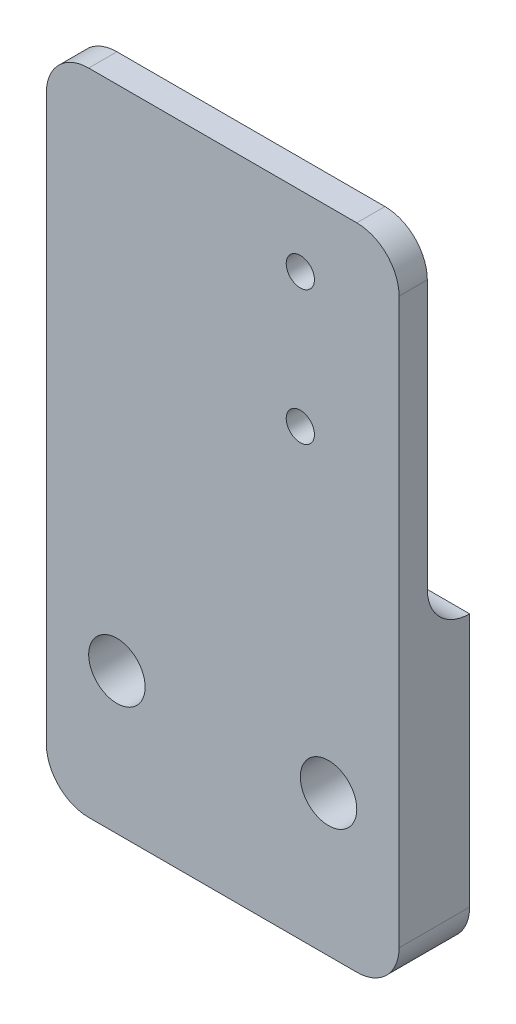
ISO-10303-21;
HEADER;
FILE_DESCRIPTION(('STEP AP214'),'2;1');
FILE_NAME('part.step','',(''),(''),'','','');
FILE_SCHEMA(('AUTOMOTIVE_DESIGN { 1 0 10303 214 1 1 1 1 }'));
ENDSEC;
DATA;
#1=APPLICATION_CONTEXT('core data for automotive mechanical design processes');
#2=APPLICATION_PROTOCOL_DEFINITION('international standard','automotive_design',2000,#1);
#3=PRODUCT_CONTEXT('',#1,'mechanical');
#4=PRODUCT('Part','Part','',(#3));
#5=PRODUCT_RELATED_PRODUCT_CATEGORY('part','',(#4));
#6=PRODUCT_DEFINITION_FORMATION('','',#4);
#7=PRODUCT_DEFINITION_CONTEXT('part definition',#1,'design');
#8=PRODUCT_DEFINITION('design','',#6,#7);
#9=PRODUCT_DEFINITION_SHAPE('','',#8);
#10=(LENGTH_UNIT() NAMED_UNIT(*) SI_UNIT(.MILLI.,.METRE.));
#11=(NAMED_UNIT(*) PLANE_ANGLE_UNIT() SI_UNIT($,.RADIAN.));
#12=(NAMED_UNIT(*) SI_UNIT($,.STERADIAN.) SOLID_ANGLE_UNIT());
#13=UNCERTAINTY_MEASURE_WITH_UNIT(LENGTH_MEASURE(1.E-05),#10,'distance_accuracy_value','');
#14=(GEOMETRIC_REPRESENTATION_CONTEXT(3) GLOBAL_UNCERTAINTY_ASSIGNED_CONTEXT((#13)) GLOBAL_UNIT_ASSIGNED_CONTEXT((#10,
#11,#12)) REPRESENTATION_CONTEXT('',''));
#15=CARTESIAN_POINT('',(0.,0.,0.));
#16=DIRECTION('',(0.,0.,1.));
#17=DIRECTION('',(1.,0.,0.));
#18=AXIS2_PLACEMENT_3D('',#15,#16,#17);
#19=CARTESIAN_POINT('',(0.,0.,5.));
#20=DIRECTION('',(0.,0.,-1.));
#21=DIRECTION('',(-1.,0.,0.));
#22=AXIS2_PLACEMENT_3D('',#19,#20,#21);
#23=PLANE('',#22);
#24=DIRECTION('',(-1.,0.,0.));
#25=VECTOR('',#24,1.);
#26=CARTESIAN_POINT('',(0.,46.,5.));
#27=LINE('',#26,#25);
#28=CARTESIAN_POINT('',(22.,46.,5.));
#29=VERTEX_POINT('',#28);
#30=CARTESIAN_POINT('',(3.,46.,5.));
#31=VERTEX_POINT('',#30);
#32=EDGE_CURVE('E193',#29,#31,#27,.T.);
#33=ORIENTED_EDGE('',*,*,#32,.T.);
#34=CARTESIAN_POINT('',(3.,43.,5.));
#35=DIRECTION('',(0.,0.,-1.));
#36=DIRECTION('',(-1.,0.,0.));
#37=AXIS2_PLACEMENT_3D('',#34,#35,#36);
#38=CIRCLE('',#37,3.);
#39=CARTESIAN_POINT('',(0.,43.,5.));
#40=VERTEX_POINT('',#39);
#41=EDGE_CURVE('E233',#31,#40,#38,.F.);
#42=ORIENTED_EDGE('',*,*,#41,.T.);
#43=DIRECTION('',(0.,-1.,0.));
#44=VECTOR('',#43,1.);
#45=CARTESIAN_POINT('',(0.,0.,5.));
#46=LINE('',#45,#44);
#47=CARTESIAN_POINT('',(0.,3.,5.));
#48=VERTEX_POINT('',#47);
#49=EDGE_CURVE('E180',#40,#48,#46,.T.);
#50=ORIENTED_EDGE('',*,*,#49,.T.);
#51=CARTESIAN_POINT('',(3.,3.,5.));
#52=DIRECTION('',(0.,0.,-1.));
#53=DIRECTION('',(-1.,0.,0.));
#54=AXIS2_PLACEMENT_3D('',#51,#52,#53);
#55=CIRCLE('',#54,3.);
#56=CARTESIAN_POINT('',(3.,0.,5.));
#57=VERTEX_POINT('',#56);
#58=EDGE_CURVE('E227',#48,#57,#55,.F.);
#59=ORIENTED_EDGE('',*,*,#58,.T.);
#60=DIRECTION('',(1.,0.,0.));
#61=VECTOR('',#60,1.);
#62=CARTESIAN_POINT('',(0.,0.,5.));
#63=LINE('',#62,#61);
#64=CARTESIAN_POINT('',(22.,0.,5.));
#65=VERTEX_POINT('',#64);
#66=EDGE_CURVE('E184',#57,#65,#63,.T.);
#67=ORIENTED_EDGE('',*,*,#66,.T.);
#68=CARTESIAN_POINT('',(22.,3.,5.));
#69=DIRECTION('',(0.,0.,-1.));
#70=DIRECTION('',(-1.,0.,0.));
#71=AXIS2_PLACEMENT_3D('',#68,#69,#70);
#72=CIRCLE('',#71,3.);
#73=CARTESIAN_POINT('',(25.,3.,5.));
#74=VERTEX_POINT('',#73);
#75=EDGE_CURVE('E224',#65,#74,#72,.F.);
#76=ORIENTED_EDGE('',*,*,#75,.T.);
#77=DIRECTION('',(0.,1.,0.));
#78=VECTOR('',#77,1.);
#79=CARTESIAN_POINT('',(25.,0.,5.));
#80=LINE('',#79,#78);
#81=CARTESIAN_POINT('',(25.,43.,5.));
#82=VERTEX_POINT('',#81);
#83=EDGE_CURVE('E189',#74,#82,#80,.T.);
#84=ORIENTED_EDGE('',*,*,#83,.T.);
#85=CARTESIAN_POINT('',(22.,43.,5.));
#86=DIRECTION('',(0.,0.,-1.));
#87=DIRECTION('',(-1.,0.,0.));
#88=AXIS2_PLACEMENT_3D('',#85,#86,#87);
#89=CIRCLE('',#88,3.);
#90=EDGE_CURVE('E230',#82,#29,#89,.F.);
#91=ORIENTED_EDGE('',*,*,#90,.T.);
#92=EDGE_LOOP('',(#33,#42,#50,#59,#67,#76,#84,#91));
#93=FACE_BOUND('',#92,.T.);
#94=CARTESIAN_POINT('',(20.,10.,5.));
#95=DIRECTION('',(0.,0.,1.));
#96=DIRECTION('',(1.,0.,0.));
#97=AXIS2_PLACEMENT_3D('',#94,#95,#96);
#98=CIRCLE('',#97,1.99999999999999);
#99=CARTESIAN_POINT('',(22.,10.,5.));
#100=VERTEX_POINT('',#99);
#101=EDGE_CURVE('E175',#100,#100,#98,.T.);
#102=ORIENTED_EDGE('',*,*,#101,.F.);
#103=EDGE_LOOP('',(#102));
#104=FACE_BOUND('',#103,.T.);
#105=CARTESIAN_POINT('',(5.,10.,5.));
#106=DIRECTION('',(0.,0.,1.));
#107=DIRECTION('',(1.,0.,0.));
#108=AXIS2_PLACEMENT_3D('',#105,#106,#107);
#109=CIRCLE('',#108,1.99999999999999);
#110=CARTESIAN_POINT('',(6.99999999999999,10.,5.));
#111=VERTEX_POINT('',#110);
#112=EDGE_CURVE('E262',#111,#111,#109,.T.);
#113=ORIENTED_EDGE('',*,*,#112,.F.);
#114=EDGE_LOOP('',(#113));
#115=FACE_BOUND('',#114,.T.);
#116=CARTESIAN_POINT('',(18.,31.5,5.));
#117=DIRECTION('',(0.,0.,1.));
#118=DIRECTION('',(1.,0.,0.));
#119=AXIS2_PLACEMENT_3D('',#116,#117,#118);
#120=CIRCLE('',#119,1.);
#121=CARTESIAN_POINT('',(19.,31.5,5.));
#122=VERTEX_POINT('',#121);
#123=EDGE_CURVE('E270',#122,#122,#120,.T.);
#124=ORIENTED_EDGE('',*,*,#123,.F.);
#125=EDGE_LOOP('',(#124));
#126=FACE_BOUND('',#125,.T.);
#127=CARTESIAN_POINT('',(18.,41.,5.));
#128=DIRECTION('',(0.,0.,1.));
#129=DIRECTION('',(1.,0.,0.));
#130=AXIS2_PLACEMENT_3D('',#127,#128,#129);
#131=CIRCLE('',#130,1.);
#132=CARTESIAN_POINT('',(19.,41.,5.));
#133=VERTEX_POINT('',#132);
#134=EDGE_CURVE('E278',#133,#133,#131,.T.);
#135=ORIENTED_EDGE('',*,*,#134,.F.);
#136=EDGE_LOOP('',(#135));
#137=FACE_BOUND('',#136,.T.);
#138=ADVANCED_FACE('F64',(#93,#104,#115,#126,#137),#23,.F.);
#139=CARTESIAN_POINT('',(0.,0.,5.));
#140=DIRECTION('',(1.,0.,0.));
#141=DIRECTION('',(0.,0.,-1.));
#142=AXIS2_PLACEMENT_3D('',#139,#140,#141);
#143=PLANE('',#142);
#144=ORIENTED_EDGE('',*,*,#49,.F.);
#145=DIRECTION('',(0.,0.,-1.));
#146=VECTOR('',#145,1.);
#147=CARTESIAN_POINT('',(0.,43.,5.));
#148=LINE('',#147,#146);
#149=CARTESIAN_POINT('',(0.,43.,3.));
#150=VERTEX_POINT('',#149);
#151=EDGE_CURVE('E208',#40,#150,#148,.T.);
#152=ORIENTED_EDGE('',*,*,#151,.T.);
#153=DIRECTION('',(0.,1.,0.));
#154=VECTOR('',#153,1.);
#155=CARTESIAN_POINT('',(0.,46.,3.));
#156=LINE('',#155,#154);
#157=CARTESIAN_POINT('',(0.,24.,3.));
#158=VERTEX_POINT('',#157);
#159=EDGE_CURVE('E148',#158,#150,#156,.T.);
#160=ORIENTED_EDGE('',*,*,#159,.F.);
#161=CARTESIAN_POINT('',(0.,24.,0.));
#162=DIRECTION('',(1.,0.,0.));
#163=DIRECTION('',(0.,0.,-1.));
#164=AXIS2_PLACEMENT_3D('',#161,#162,#163);
#165=CIRCLE('',#164,3.);
#166=CARTESIAN_POINT('',(0.,21.,0.));
#167=VERTEX_POINT('',#166);
#168=EDGE_CURVE('E141',#158,#167,#165,.T.);
#169=ORIENTED_EDGE('',*,*,#168,.T.);
#170=DIRECTION('',(0.,-1.,0.));
#171=VECTOR('',#170,1.);
#172=CARTESIAN_POINT('',(0.,0.,0.));
#173=LINE('',#172,#171);
#174=CARTESIAN_POINT('',(0.,3.,0.));
#175=VERTEX_POINT('',#174);
#176=EDGE_CURVE('E145',#167,#175,#173,.T.);
#177=ORIENTED_EDGE('',*,*,#176,.T.);
#178=DIRECTION('',(0.,0.,-1.));
#179=VECTOR('',#178,1.);
#180=CARTESIAN_POINT('',(0.,3.,5.));
#181=LINE('',#180,#179);
#182=EDGE_CURVE('E205',#175,#48,#181,.F.);
#183=ORIENTED_EDGE('',*,*,#182,.T.);
#184=EDGE_LOOP('',(#144,#152,#160,#169,#177,#183));
#185=FACE_BOUND('',#184,.T.);
#186=ADVANCED_FACE('F144',(#185),#143,.F.);
#187=CARTESIAN_POINT('',(0.,0.,5.));
#188=DIRECTION('',(0.,1.,0.));
#189=DIRECTION('',(0.,0.,1.));
#190=AXIS2_PLACEMENT_3D('',#187,#188,#189);
#191=PLANE('',#190);
#192=ORIENTED_EDGE('',*,*,#66,.F.);
#193=DIRECTION('',(0.,0.,-1.));
#194=VECTOR('',#193,1.);
#195=CARTESIAN_POINT('',(3.,0.,5.));
#196=LINE('',#195,#194);
#197=CARTESIAN_POINT('',(3.,0.,0.));
#198=VERTEX_POINT('',#197);
#199=EDGE_CURVE('E246',#57,#198,#196,.T.);
#200=ORIENTED_EDGE('',*,*,#199,.T.);
#201=DIRECTION('',(1.,0.,0.));
#202=VECTOR('',#201,1.);
#203=CARTESIAN_POINT('',(0.,0.,0.));
#204=LINE('',#203,#202);
#205=CARTESIAN_POINT('',(22.,0.,0.));
#206=VERTEX_POINT('',#205);
#207=EDGE_CURVE('E162',#198,#206,#204,.T.);
#208=ORIENTED_EDGE('',*,*,#207,.T.);
#209=DIRECTION('',(0.,0.,-1.));
#210=VECTOR('',#209,1.);
#211=CARTESIAN_POINT('',(22.,0.,5.));
#212=LINE('',#211,#210);
#213=EDGE_CURVE('E243',#206,#65,#212,.F.);
#214=ORIENTED_EDGE('',*,*,#213,.T.);
#215=EDGE_LOOP('',(#192,#200,#208,#214));
#216=FACE_BOUND('',#215,.T.);
#217=ADVANCED_FACE('F292',(#216),#191,.F.);
#218=CARTESIAN_POINT('',(25.,0.,5.));
#219=DIRECTION('',(-1.,0.,0.));
#220=DIRECTION('',(0.,0.,1.));
#221=AXIS2_PLACEMENT_3D('',#218,#219,#220);
#222=PLANE('',#221);
#223=DIRECTION('',(0.,-1.,0.));
#224=VECTOR('',#223,1.);
#225=CARTESIAN_POINT('',(25.,46.,3.));
#226=LINE('',#225,#224);
#227=CARTESIAN_POINT('',(25.,43.,3.));
#228=VERTEX_POINT('',#227);
#229=CARTESIAN_POINT('',(25.,24.,3.));
#230=VERTEX_POINT('',#229);
#231=EDGE_CURVE('E163',#228,#230,#226,.T.);
#232=ORIENTED_EDGE('',*,*,#231,.F.);
#233=DIRECTION('',(0.,0.,-1.));
#234=VECTOR('',#233,1.);
#235=CARTESIAN_POINT('',(25.,43.,5.));
#236=LINE('',#235,#234);
#237=EDGE_CURVE('E240',#228,#82,#236,.F.);
#238=ORIENTED_EDGE('',*,*,#237,.T.);
#239=ORIENTED_EDGE('',*,*,#83,.F.);
#240=DIRECTION('',(0.,0.,-1.));
#241=VECTOR('',#240,1.);
#242=CARTESIAN_POINT('',(25.,3.,5.));
#243=LINE('',#242,#241);
#244=CARTESIAN_POINT('',(25.,3.,0.));
#245=VERTEX_POINT('',#244);
#246=EDGE_CURVE('E236',#74,#245,#243,.T.);
#247=ORIENTED_EDGE('',*,*,#246,.T.);
#248=DIRECTION('',(0.,1.,0.));
#249=VECTOR('',#248,1.);
#250=CARTESIAN_POINT('',(25.,0.,0.));
#251=LINE('',#250,#249);
#252=CARTESIAN_POINT('',(25.,21.,0.));
#253=VERTEX_POINT('',#252);
#254=EDGE_CURVE('E185',#245,#253,#251,.T.);
#255=ORIENTED_EDGE('',*,*,#254,.T.);
#256=CARTESIAN_POINT('',(25.,24.,0.));
#257=DIRECTION('',(-1.,0.,0.));
#258=DIRECTION('',(0.,0.,1.));
#259=AXIS2_PLACEMENT_3D('',#256,#257,#258);
#260=CIRCLE('',#259,3.);
#261=EDGE_CURVE('E154',#253,#230,#260,.T.);
#262=ORIENTED_EDGE('',*,*,#261,.T.);
#263=EDGE_LOOP('',(#232,#238,#239,#247,#255,#262));
#264=FACE_BOUND('',#263,.T.);
#265=ADVANCED_FACE('F305',(#264),#222,.F.);
#266=CARTESIAN_POINT('',(0.,46.,5.));
#267=DIRECTION('',(0.,-1.,0.));
#268=DIRECTION('',(0.,0.,-1.));
#269=AXIS2_PLACEMENT_3D('',#266,#267,#268);
#270=PLANE('',#269);
#271=DIRECTION('',(1.,0.,0.));
#272=VECTOR('',#271,1.);
#273=CARTESIAN_POINT('',(0.,46.,3.));
#274=LINE('',#273,#272);
#275=CARTESIAN_POINT('',(3.,46.,3.));
#276=VERTEX_POINT('',#275);
#277=CARTESIAN_POINT('',(22.,46.,3.));
#278=VERTEX_POINT('',#277);
#279=EDGE_CURVE('E172',#276,#278,#274,.T.);
#280=ORIENTED_EDGE('',*,*,#279,.F.);
#281=DIRECTION('',(0.,0.,-1.));
#282=VECTOR('',#281,1.);
#283=CARTESIAN_POINT('',(3.,46.,5.));
#284=LINE('',#283,#282);
#285=EDGE_CURVE('E221',#276,#31,#284,.F.);
#286=ORIENTED_EDGE('',*,*,#285,.T.);
#287=ORIENTED_EDGE('',*,*,#32,.F.);
#288=DIRECTION('',(0.,0.,-1.));
#289=VECTOR('',#288,1.);
#290=CARTESIAN_POINT('',(22.,46.,5.));
#291=LINE('',#290,#289);
#292=EDGE_CURVE('E217',#29,#278,#291,.T.);
#293=ORIENTED_EDGE('',*,*,#292,.T.);
#294=EDGE_LOOP('',(#280,#286,#287,#293));
#295=FACE_BOUND('',#294,.T.);
#296=ADVANCED_FACE('F301',(#295),#270,.F.);
#297=CARTESIAN_POINT('',(0.,0.,0.));
#298=DIRECTION('',(0.,0.,-1.));
#299=DIRECTION('',(-1.,0.,0.));
#300=AXIS2_PLACEMENT_3D('',#297,#298,#299);
#301=PLANE('',#300);
#302=CARTESIAN_POINT('',(5.,10.,0.));
#303=DIRECTION('',(0.,0.,-1.));
#304=DIRECTION('',(-1.,0.,0.));
#305=AXIS2_PLACEMENT_3D('',#302,#303,#304);
#306=CIRCLE('',#305,1.99999999999999);
#307=CARTESIAN_POINT('',(3.00000000000001,10.,0.));
#308=VERTEX_POINT('',#307);
#309=EDGE_CURVE('E258',#308,#308,#306,.T.);
#310=ORIENTED_EDGE('',*,*,#309,.F.);
#311=EDGE_LOOP('',(#310));
#312=FACE_BOUND('',#311,.T.);
#313=CARTESIAN_POINT('',(20.,10.,0.));
#314=DIRECTION('',(0.,0.,-1.));
#315=DIRECTION('',(-1.,0.,0.));
#316=AXIS2_PLACEMENT_3D('',#313,#314,#315);
#317=CIRCLE('',#316,1.99999999999999);
#318=CARTESIAN_POINT('',(18.,10.,0.));
#319=VERTEX_POINT('',#318);
#320=EDGE_CURVE('E168',#319,#319,#317,.T.);
#321=ORIENTED_EDGE('',*,*,#320,.F.);
#322=EDGE_LOOP('',(#321));
#323=FACE_BOUND('',#322,.T.);
#324=ORIENTED_EDGE('',*,*,#207,.F.);
#325=CARTESIAN_POINT('',(3.,3.,0.));
#326=DIRECTION('',(0.,0.,-1.));
#327=DIRECTION('',(-1.,0.,0.));
#328=AXIS2_PLACEMENT_3D('',#325,#326,#327);
#329=CIRCLE('',#328,3.);
#330=EDGE_CURVE('E12',#198,#175,#329,.T.);
#331=ORIENTED_EDGE('',*,*,#330,.T.);
#332=ORIENTED_EDGE('',*,*,#176,.F.);
#333=DIRECTION('',(-1.,0.,0.));
#334=VECTOR('',#333,1.);
#335=CARTESIAN_POINT('',(0.,21.,0.));
#336=LINE('',#335,#334);
#337=EDGE_CURVE('E159',#253,#167,#336,.T.);
#338=ORIENTED_EDGE('',*,*,#337,.F.);
#339=ORIENTED_EDGE('',*,*,#254,.F.);
#340=CARTESIAN_POINT('',(22.,3.,0.));
#341=DIRECTION('',(0.,0.,-1.));
#342=DIRECTION('',(-1.,0.,0.));
#343=AXIS2_PLACEMENT_3D('',#340,#341,#342);
#344=CIRCLE('',#343,3.);
#345=EDGE_CURVE('E73',#245,#206,#344,.T.);
#346=ORIENTED_EDGE('',*,*,#345,.T.);
#347=EDGE_LOOP('',(#324,#331,#332,#338,#339,#346));
#348=FACE_BOUND('',#347,.T.);
#349=ADVANCED_FACE('F158',(#312,#323,#348),#301,.T.);
#350=CARTESIAN_POINT('',(0.,0.,3.));
#351=DIRECTION('',(0.,0.,1.));
#352=DIRECTION('',(1.,0.,0.));
#353=AXIS2_PLACEMENT_3D('',#350,#351,#352);
#354=PLANE('',#353);
#355=CARTESIAN_POINT('',(18.,41.,3.));
#356=DIRECTION('',(0.,0.,1.));
#357=DIRECTION('',(1.,0.,0.));
#358=AXIS2_PLACEMENT_3D('',#355,#356,#357);
#359=CIRCLE('',#358,1.);
#360=CARTESIAN_POINT('',(19.,41.,3.));
#361=VERTEX_POINT('',#360);
#362=EDGE_CURVE('E274',#361,#361,#359,.T.);
#363=ORIENTED_EDGE('',*,*,#362,.T.);
#364=EDGE_LOOP('',(#363));
#365=FACE_BOUND('',#364,.T.);
#366=CARTESIAN_POINT('',(18.,31.5,3.));
#367=DIRECTION('',(0.,0.,1.));
#368=DIRECTION('',(1.,0.,0.));
#369=AXIS2_PLACEMENT_3D('',#366,#367,#368);
#370=CIRCLE('',#369,1.);
#371=CARTESIAN_POINT('',(19.,31.5,3.));
#372=VERTEX_POINT('',#371);
#373=EDGE_CURVE('E266',#372,#372,#370,.T.);
#374=ORIENTED_EDGE('',*,*,#373,.T.);
#375=EDGE_LOOP('',(#374));
#376=FACE_BOUND('',#375,.T.);
#377=ORIENTED_EDGE('',*,*,#159,.T.);
#378=CARTESIAN_POINT('',(3.,43.,3.));
#379=DIRECTION('',(0.,0.,1.));
#380=DIRECTION('',(1.,0.,0.));
#381=AXIS2_PLACEMENT_3D('',#378,#379,#380);
#382=CIRCLE('',#381,3.);
#383=EDGE_CURVE('E214',#150,#276,#382,.F.);
#384=ORIENTED_EDGE('',*,*,#383,.T.);
#385=ORIENTED_EDGE('',*,*,#279,.T.);
#386=CARTESIAN_POINT('',(22.,43.,3.));
#387=DIRECTION('',(0.,0.,1.));
#388=DIRECTION('',(1.,0.,0.));
#389=AXIS2_PLACEMENT_3D('',#386,#387,#388);
#390=CIRCLE('',#389,3.);
#391=EDGE_CURVE('E211',#278,#228,#390,.F.);
#392=ORIENTED_EDGE('',*,*,#391,.T.);
#393=ORIENTED_EDGE('',*,*,#231,.T.);
#394=DIRECTION('',(-1.,0.,0.));
#395=VECTOR('',#394,1.);
#396=CARTESIAN_POINT('',(0.,24.,3.));
#397=LINE('',#396,#395);
#398=EDGE_CURVE('E155',#230,#158,#397,.T.);
#399=ORIENTED_EDGE('',*,*,#398,.T.);
#400=EDGE_LOOP('',(#377,#384,#385,#392,#393,#399));
#401=FACE_BOUND('',#400,.T.);
#402=ADVANCED_FACE('F297',(#365,#376,#401),#354,.F.);
#403=CARTESIAN_POINT('',(20.,10.,5.));
#404=DIRECTION('',(0.,0.,1.));
#405=DIRECTION('',(1.,0.,0.));
#406=AXIS2_PLACEMENT_3D('',#403,#404,#405);
#407=CYLINDRICAL_SURFACE('',#406,1.99999999999999);
#408=ORIENTED_EDGE('',*,*,#101,.T.);
#409=EDGE_LOOP('',(#408));
#410=FACE_BOUND('',#409,.T.);
#411=ORIENTED_EDGE('',*,*,#320,.T.);
#412=EDGE_LOOP('',(#411));
#413=FACE_BOUND('',#412,.T.);
#414=ADVANCED_FACE('F343',(#410,#413),#407,.F.);
#415=CARTESIAN_POINT('',(5.,10.,5.));
#416=DIRECTION('',(0.,0.,1.));
#417=DIRECTION('',(1.,0.,0.));
#418=AXIS2_PLACEMENT_3D('',#415,#416,#417);
#419=CYLINDRICAL_SURFACE('',#418,1.99999999999999);
#420=ORIENTED_EDGE('',*,*,#112,.T.);
#421=EDGE_LOOP('',(#420));
#422=FACE_BOUND('',#421,.T.);
#423=ORIENTED_EDGE('',*,*,#309,.T.);
#424=EDGE_LOOP('',(#423));
#425=FACE_BOUND('',#424,.T.);
#426=ADVANCED_FACE('F349',(#422,#425),#419,.F.);
#427=CARTESIAN_POINT('',(18.,31.5,5.));
#428=DIRECTION('',(0.,0.,1.));
#429=DIRECTION('',(1.,0.,0.));
#430=AXIS2_PLACEMENT_3D('',#427,#428,#429);
#431=CYLINDRICAL_SURFACE('',#430,1.);
#432=ORIENTED_EDGE('',*,*,#373,.F.);
#433=EDGE_LOOP('',(#432));
#434=FACE_BOUND('',#433,.T.);
#435=ORIENTED_EDGE('',*,*,#123,.T.);
#436=EDGE_LOOP('',(#435));
#437=FACE_BOUND('',#436,.T.);
#438=ADVANCED_FACE('F355',(#434,#437),#431,.F.);
#439=CARTESIAN_POINT('',(18.,41.,5.));
#440=DIRECTION('',(0.,0.,1.));
#441=DIRECTION('',(1.,0.,0.));
#442=AXIS2_PLACEMENT_3D('',#439,#440,#441);
#443=CYLINDRICAL_SURFACE('',#442,1.);
#444=ORIENTED_EDGE('',*,*,#362,.F.);
#445=EDGE_LOOP('',(#444));
#446=FACE_BOUND('',#445,.T.);
#447=ORIENTED_EDGE('',*,*,#134,.T.);
#448=EDGE_LOOP('',(#447));
#449=FACE_BOUND('',#448,.T.);
#450=ADVANCED_FACE('F283',(#446,#449),#443,.F.);
#451=CARTESIAN_POINT('',(0.,24.,0.));
#452=DIRECTION('',(1.,0.,0.));
#453=DIRECTION('',(0.,1.,0.));
#454=AXIS2_PLACEMENT_3D('',#451,#452,#453);
#455=CYLINDRICAL_SURFACE('',#454,3.);
#456=ORIENTED_EDGE('',*,*,#261,.F.);
#457=ORIENTED_EDGE('',*,*,#337,.T.);
#458=ORIENTED_EDGE('',*,*,#168,.F.);
#459=ORIENTED_EDGE('',*,*,#398,.F.);
#460=EDGE_LOOP('',(#456,#457,#458,#459));
#461=FACE_BOUND('',#460,.T.);
#462=ADVANCED_FACE('F165',(#461),#455,.F.);
#463=CARTESIAN_POINT('',(3.,43.,5.));
#464=DIRECTION('',(0.,0.,-1.));
#465=DIRECTION('',(-1.,0.,0.));
#466=AXIS2_PLACEMENT_3D('',#463,#464,#465);
#467=CYLINDRICAL_SURFACE('',#466,3.);
#468=ORIENTED_EDGE('',*,*,#41,.F.);
#469=ORIENTED_EDGE('',*,*,#285,.F.);
#470=ORIENTED_EDGE('',*,*,#383,.F.);
#471=ORIENTED_EDGE('',*,*,#151,.F.);
#472=EDGE_LOOP('',(#468,#469,#470,#471));
#473=FACE_BOUND('',#472,.T.);
#474=ADVANCED_FACE('F315',(#473),#467,.T.);
#475=CARTESIAN_POINT('',(22.,43.,5.));
#476=DIRECTION('',(0.,0.,-1.));
#477=DIRECTION('',(-1.,0.,0.));
#478=AXIS2_PLACEMENT_3D('',#475,#476,#477);
#479=CYLINDRICAL_SURFACE('',#478,3.);
#480=ORIENTED_EDGE('',*,*,#90,.F.);
#481=ORIENTED_EDGE('',*,*,#237,.F.);
#482=ORIENTED_EDGE('',*,*,#391,.F.);
#483=ORIENTED_EDGE('',*,*,#292,.F.);
#484=EDGE_LOOP('',(#480,#481,#482,#483));
#485=FACE_BOUND('',#484,.T.);
#486=ADVANCED_FACE('F318',(#485),#479,.T.);
#487=CARTESIAN_POINT('',(3.,3.,5.));
#488=DIRECTION('',(0.,0.,-1.));
#489=DIRECTION('',(-1.,0.,0.));
#490=AXIS2_PLACEMENT_3D('',#487,#488,#489);
#491=CYLINDRICAL_SURFACE('',#490,3.);
#492=ORIENTED_EDGE('',*,*,#58,.F.);
#493=ORIENTED_EDGE('',*,*,#182,.F.);
#494=ORIENTED_EDGE('',*,*,#330,.F.);
#495=ORIENTED_EDGE('',*,*,#199,.F.);
#496=EDGE_LOOP('',(#492,#493,#494,#495));
#497=FACE_BOUND('',#496,.T.);
#498=ADVANCED_FACE('F321',(#497),#491,.T.);
#499=CARTESIAN_POINT('',(22.,3.,5.));
#500=DIRECTION('',(0.,0.,-1.));
#501=DIRECTION('',(-1.,0.,0.));
#502=AXIS2_PLACEMENT_3D('',#499,#500,#501);
#503=CYLINDRICAL_SURFACE('',#502,3.);
#504=ORIENTED_EDGE('',*,*,#75,.F.);
#505=ORIENTED_EDGE('',*,*,#213,.F.);
#506=ORIENTED_EDGE('',*,*,#345,.F.);
#507=ORIENTED_EDGE('',*,*,#246,.F.);
#508=EDGE_LOOP('',(#504,#505,#506,#507));
#509=FACE_BOUND('',#508,.T.);
#510=ADVANCED_FACE('F66',(#509),#503,.T.);
#511=CLOSED_SHELL('',(#138,#186,#217,#265,#296,#349,#402,#414,#426,#438,#450,#462,#474,#486,
#498,#510));
#512=MANIFOLD_SOLID_BREP('B2',#511);
#513=ADVANCED_BREP_SHAPE_REPRESENTATION('',(#18,#512),#14);
#514=SHAPE_DEFINITION_REPRESENTATION(#9,#513);
ENDSEC;
END-ISO-10303-21;
